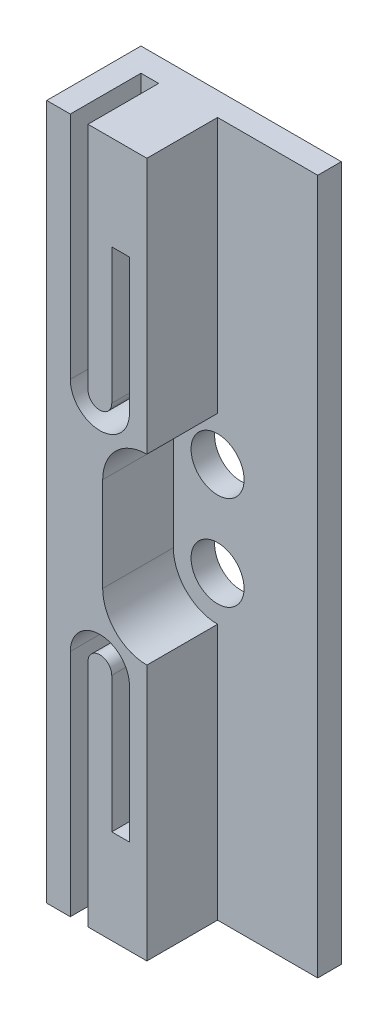
ISO-10303-21;
HEADER;
FILE_DESCRIPTION(('STEP AP214'),'2;1');
FILE_NAME('part.step','',(''),(''),'','','');
FILE_SCHEMA(('AUTOMOTIVE_DESIGN { 1 0 10303 214 1 1 1 1 }'));
ENDSEC;
DATA;
#1=APPLICATION_CONTEXT('core data for automotive mechanical design processes');
#2=APPLICATION_PROTOCOL_DEFINITION('international standard','automotive_design',2000,#1);
#3=PRODUCT_CONTEXT('',#1,'mechanical');
#4=PRODUCT('Part','Part','',(#3));
#5=PRODUCT_RELATED_PRODUCT_CATEGORY('part','',(#4));
#6=PRODUCT_DEFINITION_FORMATION('','',#4);
#7=PRODUCT_DEFINITION_CONTEXT('part definition',#1,'design');
#8=PRODUCT_DEFINITION('design','',#6,#7);
#9=PRODUCT_DEFINITION_SHAPE('','',#8);
#10=(LENGTH_UNIT() NAMED_UNIT(*) SI_UNIT(.MILLI.,.METRE.));
#11=(NAMED_UNIT(*) PLANE_ANGLE_UNIT() SI_UNIT($,.RADIAN.));
#12=(NAMED_UNIT(*) SI_UNIT($,.STERADIAN.) SOLID_ANGLE_UNIT());
#13=UNCERTAINTY_MEASURE_WITH_UNIT(LENGTH_MEASURE(1.E-05),#10,'distance_accuracy_value','');
#14=(GEOMETRIC_REPRESENTATION_CONTEXT(3) GLOBAL_UNCERTAINTY_ASSIGNED_CONTEXT((#13)) GLOBAL_UNIT_ASSIGNED_CONTEXT((#10,
#11,#12)) REPRESENTATION_CONTEXT('',''));
#15=CARTESIAN_POINT('',(0.,0.,0.));
#16=DIRECTION('',(0.,0.,1.));
#17=DIRECTION('',(1.,0.,0.));
#18=AXIS2_PLACEMENT_3D('',#15,#16,#17);
#19=CARTESIAN_POINT('',(8.5,-33.5,-6.));
#20=DIRECTION('',(0.,0.,1.));
#21=DIRECTION('',(1.,0.,0.));
#22=AXIS2_PLACEMENT_3D('',#19,#20,#21);
#23=CYLINDRICAL_SURFACE('',#22,2.25);
#24=CARTESIAN_POINT('',(8.5,-33.5,0.));
#25=DIRECTION('',(0.,0.,1.));
#26=DIRECTION('',(1.,0.,0.));
#27=AXIS2_PLACEMENT_3D('',#24,#25,#26);
#28=CIRCLE('',#27,2.25);
#29=CARTESIAN_POINT('',(10.75,-33.5,0.));
#30=VERTEX_POINT('',#29);
#31=EDGE_CURVE('E253',#30,#30,#28,.T.);
#32=ORIENTED_EDGE('',*,*,#31,.F.);
#33=EDGE_LOOP('',(#32));
#34=FACE_BOUND('',#33,.T.);
#35=CARTESIAN_POINT('',(8.5,-33.5,2.));
#36=DIRECTION('',(0.,0.,1.));
#37=DIRECTION('',(1.,0.,0.));
#38=AXIS2_PLACEMENT_3D('',#35,#36,#37);
#39=CIRCLE('',#38,2.25);
#40=CARTESIAN_POINT('',(10.75,-33.5,2.));
#41=VERTEX_POINT('',#40);
#42=EDGE_CURVE('E250',#41,#41,#39,.T.);
#43=ORIENTED_EDGE('',*,*,#42,.T.);
#44=EDGE_LOOP('',(#43));
#45=FACE_BOUND('',#44,.T.);
#46=ADVANCED_FACE('F33',(#34,#45),#23,.F.);
#47=CARTESIAN_POINT('',(8.5,-25.5,-6.));
#48=DIRECTION('',(0.,0.,1.));
#49=DIRECTION('',(1.,0.,0.));
#50=AXIS2_PLACEMENT_3D('',#47,#48,#49);
#51=CYLINDRICAL_SURFACE('',#50,2.25);
#52=CARTESIAN_POINT('',(8.5,-25.5,0.));
#53=DIRECTION('',(0.,0.,1.));
#54=DIRECTION('',(1.,0.,0.));
#55=AXIS2_PLACEMENT_3D('',#52,#53,#54);
#56=CIRCLE('',#55,2.25);
#57=CARTESIAN_POINT('',(10.75,-25.5,0.));
#58=VERTEX_POINT('',#57);
#59=EDGE_CURVE('E247',#58,#58,#56,.T.);
#60=ORIENTED_EDGE('',*,*,#59,.F.);
#61=EDGE_LOOP('',(#60));
#62=FACE_BOUND('',#61,.T.);
#63=CARTESIAN_POINT('',(8.5,-25.5,2.));
#64=DIRECTION('',(0.,0.,1.));
#65=DIRECTION('',(1.,0.,0.));
#66=AXIS2_PLACEMENT_3D('',#63,#64,#65);
#67=CIRCLE('',#66,2.25);
#68=CARTESIAN_POINT('',(10.75,-25.5,2.));
#69=VERTEX_POINT('',#68);
#70=EDGE_CURVE('E241',#69,#69,#67,.T.);
#71=ORIENTED_EDGE('',*,*,#70,.T.);
#72=EDGE_LOOP('',(#71));
#73=FACE_BOUND('',#72,.T.);
#74=ADVANCED_FACE('F463',(#62,#73),#51,.F.);
#75=CARTESIAN_POINT('',(8.50000000000001,0.,8.));
#76=DIRECTION('',(-1.,0.,0.));
#77=DIRECTION('',(0.,0.,1.));
#78=AXIS2_PLACEMENT_3D('',#75,#76,#77);
#79=PLANE('',#78);
#80=DIRECTION('',(0.,1.,0.));
#81=VECTOR('',#80,1.);
#82=CARTESIAN_POINT('',(8.50000000000001,0.,2.));
#83=LINE('',#82,#81);
#84=CARTESIAN_POINT('',(8.50000000000001,-59.,2.));
#85=VERTEX_POINT('',#84);
#86=CARTESIAN_POINT('',(8.50000000000001,-37.25,2.));
#87=VERTEX_POINT('',#86);
#88=EDGE_CURVE('E374',#85,#87,#83,.T.);
#89=ORIENTED_EDGE('',*,*,#88,.T.);
#90=DIRECTION('',(0.,0.,1.));
#91=VECTOR('',#90,1.);
#92=CARTESIAN_POINT('',(8.50000000000001,-37.25,2.));
#93=LINE('',#92,#91);
#94=CARTESIAN_POINT('',(8.50000000000001,-37.25,8.));
#95=VERTEX_POINT('',#94);
#96=EDGE_CURVE('E217',#87,#95,#93,.T.);
#97=ORIENTED_EDGE('',*,*,#96,.T.);
#98=DIRECTION('',(0.,1.,0.));
#99=VECTOR('',#98,1.);
#100=CARTESIAN_POINT('',(8.50000000000001,0.,8.));
#101=LINE('',#100,#99);
#102=CARTESIAN_POINT('',(8.50000000000001,-59.,8.));
#103=VERTEX_POINT('',#102);
#104=EDGE_CURVE('E379',#103,#95,#101,.T.);
#105=ORIENTED_EDGE('',*,*,#104,.F.);
#106=DIRECTION('',(0.,0.,-1.));
#107=VECTOR('',#106,1.);
#108=CARTESIAN_POINT('',(8.50000000000001,-59.,8.));
#109=LINE('',#108,#107);
#110=EDGE_CURVE('E390',#103,#85,#109,.T.);
#111=ORIENTED_EDGE('',*,*,#110,.T.);
#112=EDGE_LOOP('',(#89,#97,#105,#111));
#113=FACE_BOUND('',#112,.T.);
#114=ADVANCED_FACE('F468',(#113),#79,.F.);
#115=CARTESIAN_POINT('',(0.,0.,8.));
#116=DIRECTION('',(0.,0.,1.));
#117=DIRECTION('',(1.,0.,0.));
#118=AXIS2_PLACEMENT_3D('',#115,#116,#117);
#119=PLANE('',#118);
#120=CARTESIAN_POINT('',(8.5,-25.5,8.));
#121=DIRECTION('',(0.,0.,1.));
#122=DIRECTION('',(1.,0.,0.));
#123=AXIS2_PLACEMENT_3D('',#120,#121,#122);
#124=CIRCLE('',#123,3.75);
#125=CARTESIAN_POINT('',(8.50000000000001,-21.75,8.));
#126=VERTEX_POINT('',#125);
#127=CARTESIAN_POINT('',(4.75,-25.5,8.));
#128=VERTEX_POINT('',#127);
#129=EDGE_CURVE('E227',#126,#128,#124,.T.);
#130=ORIENTED_EDGE('',*,*,#129,.F.);
#131=CARTESIAN_POINT('',(8.50000000000001,0.,8.));
#132=VERTEX_POINT('',#131);
#133=EDGE_CURVE('E378',#126,#132,#101,.T.);
#134=ORIENTED_EDGE('',*,*,#133,.T.);
#135=DIRECTION('',(-1.,0.,0.));
#136=VECTOR('',#135,1.);
#137=CARTESIAN_POINT('',(0.,0.,8.));
#138=LINE('',#137,#136);
#139=CARTESIAN_POINT('',(3.50000000000001,0.,8.));
#140=VERTEX_POINT('',#139);
#141=EDGE_CURVE('E383',#132,#140,#138,.T.);
#142=ORIENTED_EDGE('',*,*,#141,.T.);
#143=DIRECTION('',(0.,1.,0.));
#144=VECTOR('',#143,1.);
#145=CARTESIAN_POINT('',(3.50000000000001,0.,8.));
#146=LINE('',#145,#144);
#147=CARTESIAN_POINT('',(3.50000000000001,-19.5,8.));
#148=VERTEX_POINT('',#147);
#149=EDGE_CURVE('E282',#148,#140,#146,.T.);
#150=ORIENTED_EDGE('',*,*,#149,.F.);
#151=CARTESIAN_POINT('',(4.5099627510071,-19.5,8.));
#152=DIRECTION('',(0.,0.,1.));
#153=DIRECTION('',(1.,0.,0.));
#154=AXIS2_PLACEMENT_3D('',#151,#152,#153);
#155=CIRCLE('',#154,1.00996275100709);
#156=CARTESIAN_POINT('',(5.51992550201419,-19.5,8.));
#157=VERTEX_POINT('',#156);
#158=EDGE_CURVE('E279',#148,#157,#155,.T.);
#159=ORIENTED_EDGE('',*,*,#158,.T.);
#160=DIRECTION('',(0.,1.,0.));
#161=VECTOR('',#160,1.);
#162=CARTESIAN_POINT('',(5.51992550201419,0.,8.));
#163=LINE('',#162,#161);
#164=CARTESIAN_POINT('',(5.51992550201419,-8.,8.));
#165=VERTEX_POINT('',#164);
#166=EDGE_CURVE('E256',#157,#165,#163,.T.);
#167=ORIENTED_EDGE('',*,*,#166,.T.);
#168=DIRECTION('',(1.,0.,0.));
#169=VECTOR('',#168,1.);
#170=CARTESIAN_POINT('',(0.,-8.,8.));
#171=LINE('',#170,#169);
#172=CARTESIAN_POINT('',(7.01992550201418,-8.,8.));
#173=VERTEX_POINT('',#172);
#174=EDGE_CURVE('E261',#165,#173,#171,.T.);
#175=ORIENTED_EDGE('',*,*,#174,.T.);
#176=DIRECTION('',(0.,1.,0.));
#177=VECTOR('',#176,1.);
#178=CARTESIAN_POINT('',(7.01992550201418,0.,8.));
#179=LINE('',#178,#177);
#180=CARTESIAN_POINT('',(7.01992550201418,-19.5,8.));
#181=VERTEX_POINT('',#180);
#182=EDGE_CURVE('E290',#181,#173,#179,.T.);
#183=ORIENTED_EDGE('',*,*,#182,.F.);
#184=CARTESIAN_POINT('',(4.50996275100709,-19.5,8.));
#185=DIRECTION('',(0.,0.,1.));
#186=DIRECTION('',(1.,0.,0.));
#187=AXIS2_PLACEMENT_3D('',#184,#185,#186);
#188=CIRCLE('',#187,2.50996275100708);
#189=CARTESIAN_POINT('',(2.00000000000001,-19.5,8.));
#190=VERTEX_POINT('',#189);
#191=EDGE_CURVE('E287',#190,#181,#188,.T.);
#192=ORIENTED_EDGE('',*,*,#191,.F.);
#193=DIRECTION('',(0.,1.,0.));
#194=VECTOR('',#193,1.);
#195=CARTESIAN_POINT('',(2.00000000000001,0.,8.));
#196=LINE('',#195,#194);
#197=CARTESIAN_POINT('',(2.00000000000001,0.,8.));
#198=VERTEX_POINT('',#197);
#199=EDGE_CURVE('E284',#190,#198,#196,.T.);
#200=ORIENTED_EDGE('',*,*,#199,.T.);
#201=CARTESIAN_POINT('',(0.,0.,8.));
#202=VERTEX_POINT('',#201);
#203=EDGE_CURVE('E382',#198,#202,#138,.T.);
#204=ORIENTED_EDGE('',*,*,#203,.T.);
#205=DIRECTION('',(0.,-1.,0.));
#206=VECTOR('',#205,1.);
#207=CARTESIAN_POINT('',(0.,0.,8.));
#208=LINE('',#207,#206);
#209=CARTESIAN_POINT('',(0.,-59.,8.));
#210=VERTEX_POINT('',#209);
#211=EDGE_CURVE('E370',#202,#210,#208,.T.);
#212=ORIENTED_EDGE('',*,*,#211,.T.);
#213=DIRECTION('',(1.,0.,0.));
#214=VECTOR('',#213,1.);
#215=CARTESIAN_POINT('',(0.,-59.,8.));
#216=LINE('',#215,#214);
#217=CARTESIAN_POINT('',(2.00000000000001,-59.,8.));
#218=VERTEX_POINT('',#217);
#219=EDGE_CURVE('E375',#210,#218,#216,.T.);
#220=ORIENTED_EDGE('',*,*,#219,.T.);
#221=DIRECTION('',(0.,1.,0.));
#222=VECTOR('',#221,1.);
#223=CARTESIAN_POINT('',(2.00000000000001,0.,8.));
#224=LINE('',#223,#222);
#225=CARTESIAN_POINT('',(2.00000000000001,-39.5,8.));
#226=VERTEX_POINT('',#225);
#227=EDGE_CURVE('E316',#218,#226,#224,.T.);
#228=ORIENTED_EDGE('',*,*,#227,.T.);
#229=CARTESIAN_POINT('',(4.50996275100709,-39.5,8.));
#230=DIRECTION('',(0.,0.,1.));
#231=DIRECTION('',(1.,0.,0.));
#232=AXIS2_PLACEMENT_3D('',#229,#230,#231);
#233=CIRCLE('',#232,2.50996275100709);
#234=CARTESIAN_POINT('',(7.01992550201419,-39.5,8.));
#235=VERTEX_POINT('',#234);
#236=EDGE_CURVE('E348',#226,#235,#233,.F.);
#237=ORIENTED_EDGE('',*,*,#236,.T.);
#238=DIRECTION('',(0.,1.,0.));
#239=VECTOR('',#238,1.);
#240=CARTESIAN_POINT('',(7.01992550201418,0.,8.));
#241=LINE('',#240,#239);
#242=CARTESIAN_POINT('',(7.01992550201419,-51.,8.));
#243=VERTEX_POINT('',#242);
#244=EDGE_CURVE('E345',#243,#235,#241,.T.);
#245=ORIENTED_EDGE('',*,*,#244,.F.);
#246=DIRECTION('',(1.,0.,0.));
#247=VECTOR('',#246,1.);
#248=CARTESIAN_POINT('',(0.,-51.,8.));
#249=LINE('',#248,#247);
#250=CARTESIAN_POINT('',(5.51992550201419,-51.,8.));
#251=VERTEX_POINT('',#250);
#252=EDGE_CURVE('E342',#251,#243,#249,.T.);
#253=ORIENTED_EDGE('',*,*,#252,.F.);
#254=DIRECTION('',(0.,1.,0.));
#255=VECTOR('',#254,1.);
#256=CARTESIAN_POINT('',(5.51992550201419,0.,8.));
#257=LINE('',#256,#255);
#258=CARTESIAN_POINT('',(5.51992550201419,-39.5,8.));
#259=VERTEX_POINT('',#258);
#260=EDGE_CURVE('E339',#251,#259,#257,.T.);
#261=ORIENTED_EDGE('',*,*,#260,.T.);
#262=CARTESIAN_POINT('',(4.5099627510071,-39.5,8.));
#263=DIRECTION('',(0.,0.,1.));
#264=DIRECTION('',(1.,0.,0.));
#265=AXIS2_PLACEMENT_3D('',#262,#263,#264);
#266=CIRCLE('',#265,1.00996275100709);
#267=CARTESIAN_POINT('',(3.50000000000001,-39.5,8.));
#268=VERTEX_POINT('',#267);
#269=EDGE_CURVE('E336',#268,#259,#266,.F.);
#270=ORIENTED_EDGE('',*,*,#269,.F.);
#271=DIRECTION('',(0.,1.,0.));
#272=VECTOR('',#271,1.);
#273=CARTESIAN_POINT('',(3.50000000000001,0.,8.));
#274=LINE('',#273,#272);
#275=CARTESIAN_POINT('',(3.50000000000001,-59.,8.));
#276=VERTEX_POINT('',#275);
#277=EDGE_CURVE('E56',#276,#268,#274,.T.);
#278=ORIENTED_EDGE('',*,*,#277,.F.);
#279=EDGE_CURVE('E373',#276,#103,#216,.T.);
#280=ORIENTED_EDGE('',*,*,#279,.T.);
#281=ORIENTED_EDGE('',*,*,#104,.T.);
#282=CARTESIAN_POINT('',(8.5,-33.5,8.));
#283=DIRECTION('',(0.,0.,1.));
#284=DIRECTION('',(1.,0.,0.));
#285=AXIS2_PLACEMENT_3D('',#282,#283,#284);
#286=CIRCLE('',#285,3.75);
#287=CARTESIAN_POINT('',(4.75,-33.5,8.));
#288=VERTEX_POINT('',#287);
#289=EDGE_CURVE('E235',#288,#95,#286,.T.);
#290=ORIENTED_EDGE('',*,*,#289,.F.);
#291=DIRECTION('',(0.,1.,0.));
#292=VECTOR('',#291,1.);
#293=CARTESIAN_POINT('',(4.75,0.,8.));
#294=LINE('',#293,#292);
#295=EDGE_CURVE('E213',#288,#128,#294,.T.);
#296=ORIENTED_EDGE('',*,*,#295,.T.);
#297=EDGE_LOOP('',(#130,#134,#142,#150,#159,#167,#175,#183,#192,#200,#204,#212,#220,#228,#237,
#245,#253,#261,#270,#278,#280,#281,#290,#296));
#298=FACE_BOUND('',#297,.T.);
#299=ADVANCED_FACE('F438',(#298),#119,.T.);
#300=CARTESIAN_POINT('',(0.,0.,2.));
#301=DIRECTION('',(0.,-1.,0.));
#302=DIRECTION('',(0.,0.,-1.));
#303=AXIS2_PLACEMENT_3D('',#300,#301,#302);
#304=PLANE('',#303);
#305=DIRECTION('',(0.,0.,1.));
#306=VECTOR('',#305,1.);
#307=CARTESIAN_POINT('',(2.00000000000001,0.,2.));
#308=LINE('',#307,#306);
#309=CARTESIAN_POINT('',(2.00000000000001,0.,2.));
#310=VERTEX_POINT('',#309);
#311=EDGE_CURVE('E304',#310,#198,#308,.T.);
#312=ORIENTED_EDGE('',*,*,#311,.F.);
#313=DIRECTION('',(-1.,0.,0.));
#314=VECTOR('',#313,1.);
#315=CARTESIAN_POINT('',(0.,0.,2.));
#316=LINE('',#315,#314);
#317=CARTESIAN_POINT('',(3.50000000000001,0.,2.));
#318=VERTEX_POINT('',#317);
#319=EDGE_CURVE('E264',#318,#310,#316,.T.);
#320=ORIENTED_EDGE('',*,*,#319,.F.);
#321=DIRECTION('',(0.,0.,1.));
#322=VECTOR('',#321,1.);
#323=CARTESIAN_POINT('',(3.50000000000001,0.,2.));
#324=LINE('',#323,#322);
#325=EDGE_CURVE('E306',#318,#140,#324,.T.);
#326=ORIENTED_EDGE('',*,*,#325,.T.);
#327=ORIENTED_EDGE('',*,*,#141,.F.);
#328=DIRECTION('',(0.,0.,-1.));
#329=VECTOR('',#328,1.);
#330=CARTESIAN_POINT('',(8.50000000000001,0.,8.));
#331=LINE('',#330,#329);
#332=CARTESIAN_POINT('',(8.50000000000001,0.,2.));
#333=VERTEX_POINT('',#332);
#334=EDGE_CURVE('E386',#132,#333,#331,.T.);
#335=ORIENTED_EDGE('',*,*,#334,.T.);
#336=DIRECTION('',(-1.,0.,0.));
#337=VECTOR('',#336,1.);
#338=CARTESIAN_POINT('',(0.,0.,2.));
#339=LINE('',#338,#337);
#340=CARTESIAN_POINT('',(17.,0.,2.));
#341=VERTEX_POINT('',#340);
#342=EDGE_CURVE('E399',#341,#333,#339,.T.);
#343=ORIENTED_EDGE('',*,*,#342,.F.);
#344=DIRECTION('',(0.,0.,-1.));
#345=VECTOR('',#344,1.);
#346=CARTESIAN_POINT('',(17.,0.,2.));
#347=LINE('',#346,#345);
#348=CARTESIAN_POINT('',(17.,0.,0.));
#349=VERTEX_POINT('',#348);
#350=EDGE_CURVE('E412',#341,#349,#347,.T.);
#351=ORIENTED_EDGE('',*,*,#350,.T.);
#352=DIRECTION('',(-1.,0.,0.));
#353=VECTOR('',#352,1.);
#354=CARTESIAN_POINT('',(0.,0.,0.));
#355=LINE('',#354,#353);
#356=CARTESIAN_POINT('',(0.,0.,0.));
#357=VERTEX_POINT('',#356);
#358=EDGE_CURVE('E397',#349,#357,#355,.T.);
#359=ORIENTED_EDGE('',*,*,#358,.T.);
#360=DIRECTION('',(0.,0.,-1.));
#361=VECTOR('',#360,1.);
#362=CARTESIAN_POINT('',(0.,0.,2.));
#363=LINE('',#362,#361);
#364=EDGE_CURVE('E402',#202,#357,#363,.T.);
#365=ORIENTED_EDGE('',*,*,#364,.F.);
#366=ORIENTED_EDGE('',*,*,#203,.F.);
#367=EDGE_LOOP('',(#312,#320,#326,#327,#335,#343,#351,#359,#365,#366));
#368=FACE_BOUND('',#367,.T.);
#369=ADVANCED_FACE('F430',(#368),#304,.F.);
#370=CARTESIAN_POINT('',(0.,0.,2.));
#371=DIRECTION('',(1.,0.,0.));
#372=DIRECTION('',(0.,1.,0.));
#373=AXIS2_PLACEMENT_3D('',#370,#371,#372);
#374=PLANE('',#373);
#375=DIRECTION('',(0.,-1.,0.));
#376=VECTOR('',#375,1.);
#377=CARTESIAN_POINT('',(0.,0.,0.));
#378=LINE('',#377,#376);
#379=CARTESIAN_POINT('',(0.,-59.,0.));
#380=VERTEX_POINT('',#379);
#381=EDGE_CURVE('E393',#357,#380,#378,.T.);
#382=ORIENTED_EDGE('',*,*,#381,.T.);
#383=DIRECTION('',(0.,0.,-1.));
#384=VECTOR('',#383,1.);
#385=CARTESIAN_POINT('',(0.,-59.,2.));
#386=LINE('',#385,#384);
#387=EDGE_CURVE('E11',#210,#380,#386,.T.);
#388=ORIENTED_EDGE('',*,*,#387,.F.);
#389=ORIENTED_EDGE('',*,*,#211,.F.);
#390=ORIENTED_EDGE('',*,*,#364,.T.);
#391=EDGE_LOOP('',(#382,#388,#389,#390));
#392=FACE_BOUND('',#391,.T.);
#393=ADVANCED_FACE('F35',(#392),#374,.F.);
#394=CARTESIAN_POINT('',(0.,-59.,2.));
#395=DIRECTION('',(0.,1.,0.));
#396=DIRECTION('',(0.,0.,1.));
#397=AXIS2_PLACEMENT_3D('',#394,#395,#396);
#398=PLANE('',#397);
#399=ORIENTED_EDGE('',*,*,#279,.F.);
#400=DIRECTION('',(0.,0.,1.));
#401=VECTOR('',#400,1.);
#402=CARTESIAN_POINT('',(3.50000000000001,-59.,2.));
#403=LINE('',#402,#401);
#404=CARTESIAN_POINT('',(3.50000000000001,-59.,2.));
#405=VERTEX_POINT('',#404);
#406=EDGE_CURVE('E353',#405,#276,#403,.T.);
#407=ORIENTED_EDGE('',*,*,#406,.F.);
#408=DIRECTION('',(1.,0.,0.));
#409=VECTOR('',#408,1.);
#410=CARTESIAN_POINT('',(0.,-59.,2.));
#411=LINE('',#410,#409);
#412=CARTESIAN_POINT('',(2.00000000000001,-59.,2.));
#413=VERTEX_POINT('',#412);
#414=EDGE_CURVE('E331',#413,#405,#411,.T.);
#415=ORIENTED_EDGE('',*,*,#414,.F.);
#416=DIRECTION('',(0.,0.,1.));
#417=VECTOR('',#416,1.);
#418=CARTESIAN_POINT('',(2.00000000000001,-59.,2.));
#419=LINE('',#418,#417);
#420=EDGE_CURVE('E356',#413,#218,#419,.T.);
#421=ORIENTED_EDGE('',*,*,#420,.T.);
#422=ORIENTED_EDGE('',*,*,#219,.F.);
#423=ORIENTED_EDGE('',*,*,#387,.T.);
#424=DIRECTION('',(1.,0.,0.));
#425=VECTOR('',#424,1.);
#426=CARTESIAN_POINT('',(0.,-59.,0.));
#427=LINE('',#426,#425);
#428=CARTESIAN_POINT('',(17.,-59.,0.));
#429=VERTEX_POINT('',#428);
#430=EDGE_CURVE('E405',#380,#429,#427,.T.);
#431=ORIENTED_EDGE('',*,*,#430,.T.);
#432=DIRECTION('',(0.,0.,-1.));
#433=VECTOR('',#432,1.);
#434=CARTESIAN_POINT('',(17.,-59.,2.));
#435=LINE('',#434,#433);
#436=CARTESIAN_POINT('',(17.,-59.,2.));
#437=VERTEX_POINT('',#436);
#438=EDGE_CURVE('E41',#437,#429,#435,.T.);
#439=ORIENTED_EDGE('',*,*,#438,.F.);
#440=DIRECTION('',(1.,0.,0.));
#441=VECTOR('',#440,1.);
#442=CARTESIAN_POINT('',(0.,-59.,2.));
#443=LINE('',#442,#441);
#444=EDGE_CURVE('E394',#85,#437,#443,.T.);
#445=ORIENTED_EDGE('',*,*,#444,.F.);
#446=ORIENTED_EDGE('',*,*,#110,.F.);
#447=EDGE_LOOP('',(#399,#407,#415,#421,#422,#423,#431,#439,#445,#446));
#448=FACE_BOUND('',#447,.T.);
#449=ADVANCED_FACE('F486',(#448),#398,.F.);
#450=CARTESIAN_POINT('',(17.,0.,2.));
#451=DIRECTION('',(-1.,0.,0.));
#452=DIRECTION('',(0.,-1.,0.));
#453=AXIS2_PLACEMENT_3D('',#450,#451,#452);
#454=PLANE('',#453);
#455=DIRECTION('',(0.,1.,0.));
#456=VECTOR('',#455,1.);
#457=CARTESIAN_POINT('',(17.,0.,0.));
#458=LINE('',#457,#456);
#459=EDGE_CURVE('E407',#429,#349,#458,.T.);
#460=ORIENTED_EDGE('',*,*,#459,.T.);
#461=ORIENTED_EDGE('',*,*,#350,.F.);
#462=DIRECTION('',(0.,1.,0.));
#463=VECTOR('',#462,1.);
#464=CARTESIAN_POINT('',(17.,0.,2.));
#465=LINE('',#464,#463);
#466=EDGE_CURVE('E396',#437,#341,#465,.T.);
#467=ORIENTED_EDGE('',*,*,#466,.F.);
#468=ORIENTED_EDGE('',*,*,#438,.T.);
#469=EDGE_LOOP('',(#460,#461,#467,#468));
#470=FACE_BOUND('',#469,.T.);
#471=ADVANCED_FACE('F419',(#470),#454,.F.);
#472=CARTESIAN_POINT('',(0.,0.,2.));
#473=DIRECTION('',(0.,0.,1.));
#474=DIRECTION('',(1.,0.,0.));
#475=AXIS2_PLACEMENT_3D('',#472,#473,#474);
#476=PLANE('',#475);
#477=ORIENTED_EDGE('',*,*,#70,.F.);
#478=EDGE_LOOP('',(#477));
#479=FACE_BOUND('',#478,.T.);
#480=ORIENTED_EDGE('',*,*,#42,.F.);
#481=EDGE_LOOP('',(#480));
#482=FACE_BOUND('',#481,.T.);
#483=CARTESIAN_POINT('',(8.5,-33.5,2.));
#484=DIRECTION('',(0.,0.,1.));
#485=DIRECTION('',(1.,0.,0.));
#486=AXIS2_PLACEMENT_3D('',#483,#484,#485);
#487=CIRCLE('',#486,3.75);
#488=CARTESIAN_POINT('',(4.75,-33.5,2.));
#489=VERTEX_POINT('',#488);
#490=EDGE_CURVE('E224',#489,#87,#487,.T.);
#491=ORIENTED_EDGE('',*,*,#490,.T.);
#492=ORIENTED_EDGE('',*,*,#88,.F.);
#493=ORIENTED_EDGE('',*,*,#444,.T.);
#494=ORIENTED_EDGE('',*,*,#466,.T.);
#495=ORIENTED_EDGE('',*,*,#342,.T.);
#496=CARTESIAN_POINT('',(8.50000000000001,-21.75,2.));
#497=VERTEX_POINT('',#496);
#498=EDGE_CURVE('E355',#497,#333,#83,.T.);
#499=ORIENTED_EDGE('',*,*,#498,.F.);
#500=CARTESIAN_POINT('',(8.5,-25.5,2.));
#501=DIRECTION('',(0.,0.,1.));
#502=DIRECTION('',(1.,0.,0.));
#503=AXIS2_PLACEMENT_3D('',#500,#501,#502);
#504=CIRCLE('',#503,3.75);
#505=CARTESIAN_POINT('',(4.75,-25.5,2.));
#506=VERTEX_POINT('',#505);
#507=EDGE_CURVE('E218',#497,#506,#504,.T.);
#508=ORIENTED_EDGE('',*,*,#507,.T.);
#509=DIRECTION('',(0.,1.,0.));
#510=VECTOR('',#509,1.);
#511=CARTESIAN_POINT('',(4.75,0.,2.));
#512=LINE('',#511,#510);
#513=EDGE_CURVE('E210',#489,#506,#512,.T.);
#514=ORIENTED_EDGE('',*,*,#513,.F.);
#515=EDGE_LOOP('',(#491,#492,#493,#494,#495,#499,#508,#514));
#516=FACE_BOUND('',#515,.T.);
#517=ADVANCED_FACE('F223',(#479,#482,#516),#476,.T.);
#518=CARTESIAN_POINT('',(0.,0.,0.));
#519=DIRECTION('',(0.,0.,1.));
#520=DIRECTION('',(1.,0.,0.));
#521=AXIS2_PLACEMENT_3D('',#518,#519,#520);
#522=PLANE('',#521);
#523=ORIENTED_EDGE('',*,*,#59,.T.);
#524=EDGE_LOOP('',(#523));
#525=FACE_BOUND('',#524,.T.);
#526=ORIENTED_EDGE('',*,*,#31,.T.);
#527=EDGE_LOOP('',(#526));
#528=FACE_BOUND('',#527,.T.);
#529=ORIENTED_EDGE('',*,*,#381,.F.);
#530=ORIENTED_EDGE('',*,*,#358,.F.);
#531=ORIENTED_EDGE('',*,*,#459,.F.);
#532=ORIENTED_EDGE('',*,*,#430,.F.);
#533=EDGE_LOOP('',(#529,#530,#531,#532));
#534=FACE_BOUND('',#533,.T.);
#535=ADVANCED_FACE('F426',(#525,#528,#534),#522,.F.);
#536=ORIENTED_EDGE('',*,*,#133,.F.);
#537=DIRECTION('',(0.,0.,1.));
#538=VECTOR('',#537,1.);
#539=CARTESIAN_POINT('',(8.50000000000001,-21.75,2.));
#540=LINE('',#539,#538);
#541=EDGE_CURVE('E242',#497,#126,#540,.T.);
#542=ORIENTED_EDGE('',*,*,#541,.F.);
#543=ORIENTED_EDGE('',*,*,#498,.T.);
#544=ORIENTED_EDGE('',*,*,#334,.F.);
#545=EDGE_LOOP('',(#536,#542,#543,#544));
#546=FACE_BOUND('',#545,.T.);
#547=ADVANCED_FACE('F530',(#546),#79,.F.);
#548=CARTESIAN_POINT('',(3.50000000000001,0.,2.));
#549=DIRECTION('',(1.,0.,0.));
#550=DIRECTION('',(0.,0.,-1.));
#551=AXIS2_PLACEMENT_3D('',#548,#549,#550);
#552=PLANE('',#551);
#553=ORIENTED_EDGE('',*,*,#277,.T.);
#554=DIRECTION('',(0.,0.,1.));
#555=VECTOR('',#554,1.);
#556=CARTESIAN_POINT('',(3.50000000000001,-39.5,2.));
#557=LINE('',#556,#555);
#558=CARTESIAN_POINT('',(3.50000000000001,-39.5,2.));
#559=VERTEX_POINT('',#558);
#560=EDGE_CURVE('E334',#559,#268,#557,.T.);
#561=ORIENTED_EDGE('',*,*,#560,.F.);
#562=DIRECTION('',(0.,1.,0.));
#563=VECTOR('',#562,1.);
#564=CARTESIAN_POINT('',(3.50000000000001,0.,2.));
#565=LINE('',#564,#563);
#566=EDGE_CURVE('E312',#405,#559,#565,.T.);
#567=ORIENTED_EDGE('',*,*,#566,.F.);
#568=ORIENTED_EDGE('',*,*,#406,.T.);
#569=EDGE_LOOP('',(#553,#561,#567,#568));
#570=FACE_BOUND('',#569,.T.);
#571=ADVANCED_FACE('F496',(#570),#552,.F.);
#572=CARTESIAN_POINT('',(2.00000000000001,0.,2.));
#573=DIRECTION('',(1.,0.,0.));
#574=DIRECTION('',(0.,0.,-1.));
#575=AXIS2_PLACEMENT_3D('',#572,#573,#574);
#576=PLANE('',#575);
#577=ORIENTED_EDGE('',*,*,#227,.F.);
#578=ORIENTED_EDGE('',*,*,#420,.F.);
#579=DIRECTION('',(0.,1.,0.));
#580=VECTOR('',#579,1.);
#581=CARTESIAN_POINT('',(2.00000000000001,0.,2.));
#582=LINE('',#581,#580);
#583=CARTESIAN_POINT('',(2.00000000000001,-39.5,2.));
#584=VERTEX_POINT('',#583);
#585=EDGE_CURVE('E329',#413,#584,#582,.T.);
#586=ORIENTED_EDGE('',*,*,#585,.T.);
#587=DIRECTION('',(0.,0.,1.));
#588=VECTOR('',#587,1.);
#589=CARTESIAN_POINT('',(2.00000000000001,-39.5,2.));
#590=LINE('',#589,#588);
#591=EDGE_CURVE('E359',#584,#226,#590,.T.);
#592=ORIENTED_EDGE('',*,*,#591,.T.);
#593=EDGE_LOOP('',(#577,#578,#586,#592));
#594=FACE_BOUND('',#593,.T.);
#595=ADVANCED_FACE('F502',(#594),#576,.T.);
#596=CARTESIAN_POINT('',(4.50996275100709,-39.5,2.));
#597=DIRECTION('',(0.,0.,1.));
#598=DIRECTION('',(1.,0.,0.));
#599=AXIS2_PLACEMENT_3D('',#596,#597,#598);
#600=CYLINDRICAL_SURFACE('',#599,2.50996275100709);
#601=ORIENTED_EDGE('',*,*,#236,.F.);
#602=ORIENTED_EDGE('',*,*,#591,.F.);
#603=CARTESIAN_POINT('',(4.50996275100709,-39.5,2.));
#604=DIRECTION('',(0.,0.,1.));
#605=DIRECTION('',(1.,0.,0.));
#606=AXIS2_PLACEMENT_3D('',#603,#604,#605);
#607=CIRCLE('',#606,2.50996275100709);
#608=CARTESIAN_POINT('',(7.01992550201419,-39.5,2.));
#609=VERTEX_POINT('',#608);
#610=EDGE_CURVE('E327',#584,#609,#607,.F.);
#611=ORIENTED_EDGE('',*,*,#610,.T.);
#612=DIRECTION('',(0.,0.,1.));
#613=VECTOR('',#612,1.);
#614=CARTESIAN_POINT('',(7.01992550201419,-39.5,2.));
#615=LINE('',#614,#613);
#616=EDGE_CURVE('E361',#609,#235,#615,.T.);
#617=ORIENTED_EDGE('',*,*,#616,.T.);
#618=EDGE_LOOP('',(#601,#602,#611,#617));
#619=FACE_BOUND('',#618,.T.);
#620=ADVANCED_FACE('F507',(#619),#600,.F.);
#621=CARTESIAN_POINT('',(7.01992550201418,0.,2.));
#622=DIRECTION('',(1.,0.,0.));
#623=DIRECTION('',(0.,1.,0.));
#624=AXIS2_PLACEMENT_3D('',#621,#622,#623);
#625=PLANE('',#624);
#626=ORIENTED_EDGE('',*,*,#244,.T.);
#627=ORIENTED_EDGE('',*,*,#616,.F.);
#628=DIRECTION('',(0.,1.,0.));
#629=VECTOR('',#628,1.);
#630=CARTESIAN_POINT('',(7.01992550201418,0.,2.));
#631=LINE('',#630,#629);
#632=CARTESIAN_POINT('',(7.01992550201419,-51.,2.));
#633=VERTEX_POINT('',#632);
#634=EDGE_CURVE('E324',#633,#609,#631,.T.);
#635=ORIENTED_EDGE('',*,*,#634,.F.);
#636=DIRECTION('',(0.,0.,1.));
#637=VECTOR('',#636,1.);
#638=CARTESIAN_POINT('',(7.01992550201419,-51.,2.));
#639=LINE('',#638,#637);
#640=EDGE_CURVE('E363',#633,#243,#639,.T.);
#641=ORIENTED_EDGE('',*,*,#640,.T.);
#642=EDGE_LOOP('',(#626,#627,#635,#641));
#643=FACE_BOUND('',#642,.T.);
#644=ADVANCED_FACE('F511',(#643),#625,.F.);
#645=CARTESIAN_POINT('',(0.,-51.,2.));
#646=DIRECTION('',(0.,-1.,0.));
#647=DIRECTION('',(0.,0.,-1.));
#648=AXIS2_PLACEMENT_3D('',#645,#646,#647);
#649=PLANE('',#648);
#650=ORIENTED_EDGE('',*,*,#252,.T.);
#651=ORIENTED_EDGE('',*,*,#640,.F.);
#652=DIRECTION('',(1.,0.,0.));
#653=VECTOR('',#652,1.);
#654=CARTESIAN_POINT('',(0.,-51.,2.));
#655=LINE('',#654,#653);
#656=CARTESIAN_POINT('',(5.51992550201419,-51.,2.));
#657=VERTEX_POINT('',#656);
#658=EDGE_CURVE('E321',#657,#633,#655,.T.);
#659=ORIENTED_EDGE('',*,*,#658,.F.);
#660=DIRECTION('',(0.,0.,1.));
#661=VECTOR('',#660,1.);
#662=CARTESIAN_POINT('',(5.51992550201419,-51.,2.));
#663=LINE('',#662,#661);
#664=EDGE_CURVE('E365',#657,#251,#663,.T.);
#665=ORIENTED_EDGE('',*,*,#664,.T.);
#666=EDGE_LOOP('',(#650,#651,#659,#665));
#667=FACE_BOUND('',#666,.T.);
#668=ADVANCED_FACE('F514',(#667),#649,.F.);
#669=CARTESIAN_POINT('',(5.51992550201419,0.,2.));
#670=DIRECTION('',(1.,0.,0.));
#671=DIRECTION('',(0.,0.,-1.));
#672=AXIS2_PLACEMENT_3D('',#669,#670,#671);
#673=PLANE('',#672);
#674=ORIENTED_EDGE('',*,*,#260,.F.);
#675=ORIENTED_EDGE('',*,*,#664,.F.);
#676=DIRECTION('',(0.,1.,0.));
#677=VECTOR('',#676,1.);
#678=CARTESIAN_POINT('',(5.51992550201419,0.,2.));
#679=LINE('',#678,#677);
#680=CARTESIAN_POINT('',(5.51992550201419,-39.5,2.));
#681=VERTEX_POINT('',#680);
#682=EDGE_CURVE('E319',#657,#681,#679,.T.);
#683=ORIENTED_EDGE('',*,*,#682,.T.);
#684=DIRECTION('',(0.,0.,1.));
#685=VECTOR('',#684,1.);
#686=CARTESIAN_POINT('',(5.51992550201419,-39.5,2.));
#687=LINE('',#686,#685);
#688=EDGE_CURVE('E367',#681,#259,#687,.T.);
#689=ORIENTED_EDGE('',*,*,#688,.T.);
#690=EDGE_LOOP('',(#674,#675,#683,#689));
#691=FACE_BOUND('',#690,.T.);
#692=ADVANCED_FACE('F517',(#691),#673,.T.);
#693=CARTESIAN_POINT('',(4.5099627510071,-39.5,2.));
#694=DIRECTION('',(0.,0.,1.));
#695=DIRECTION('',(1.,0.,0.));
#696=AXIS2_PLACEMENT_3D('',#693,#694,#695);
#697=CYLINDRICAL_SURFACE('',#696,1.00996275100709);
#698=ORIENTED_EDGE('',*,*,#269,.T.);
#699=ORIENTED_EDGE('',*,*,#688,.F.);
#700=CARTESIAN_POINT('',(4.5099627510071,-39.5,2.));
#701=DIRECTION('',(0.,0.,1.));
#702=DIRECTION('',(1.,0.,0.));
#703=AXIS2_PLACEMENT_3D('',#700,#701,#702);
#704=CIRCLE('',#703,1.00996275100709);
#705=EDGE_CURVE('E315',#559,#681,#704,.F.);
#706=ORIENTED_EDGE('',*,*,#705,.F.);
#707=ORIENTED_EDGE('',*,*,#560,.T.);
#708=EDGE_LOOP('',(#698,#699,#706,#707));
#709=FACE_BOUND('',#708,.T.);
#710=ADVANCED_FACE('F494',(#709),#697,.T.);
#711=CARTESIAN_POINT('',(0.,0.,2.));
#712=DIRECTION('',(0.,0.,1.));
#713=DIRECTION('',(1.,0.,0.));
#714=AXIS2_PLACEMENT_3D('',#711,#712,#713);
#715=PLANE('',#714);
#716=ORIENTED_EDGE('',*,*,#566,.T.);
#717=ORIENTED_EDGE('',*,*,#705,.T.);
#718=ORIENTED_EDGE('',*,*,#682,.F.);
#719=ORIENTED_EDGE('',*,*,#658,.T.);
#720=ORIENTED_EDGE('',*,*,#634,.T.);
#721=ORIENTED_EDGE('',*,*,#610,.F.);
#722=ORIENTED_EDGE('',*,*,#585,.F.);
#723=ORIENTED_EDGE('',*,*,#414,.T.);
#724=EDGE_LOOP('',(#716,#717,#718,#719,#720,#721,#722,#723));
#725=FACE_BOUND('',#724,.T.);
#726=ADVANCED_FACE('F499',(#725),#715,.T.);
#727=CARTESIAN_POINT('',(5.51992550201419,0.,2.));
#728=DIRECTION('',(1.,0.,0.));
#729=DIRECTION('',(0.,0.,-1.));
#730=AXIS2_PLACEMENT_3D('',#727,#728,#729);
#731=PLANE('',#730);
#732=ORIENTED_EDGE('',*,*,#166,.F.);
#733=DIRECTION('',(0.,0.,1.));
#734=VECTOR('',#733,1.);
#735=CARTESIAN_POINT('',(5.51992550201419,-19.5,2.));
#736=LINE('',#735,#734);
#737=CARTESIAN_POINT('',(5.51992550201419,-19.5,2.));
#738=VERTEX_POINT('',#737);
#739=EDGE_CURVE('E276',#738,#157,#736,.T.);
#740=ORIENTED_EDGE('',*,*,#739,.F.);
#741=DIRECTION('',(0.,1.,0.));
#742=VECTOR('',#741,1.);
#743=CARTESIAN_POINT('',(5.51992550201419,0.,2.));
#744=LINE('',#743,#742);
#745=CARTESIAN_POINT('',(5.51992550201419,-8.,2.));
#746=VERTEX_POINT('',#745);
#747=EDGE_CURVE('E257',#738,#746,#744,.T.);
#748=ORIENTED_EDGE('',*,*,#747,.T.);
#749=DIRECTION('',(0.,0.,1.));
#750=VECTOR('',#749,1.);
#751=CARTESIAN_POINT('',(5.51992550201419,-8.,2.));
#752=LINE('',#751,#750);
#753=EDGE_CURVE('E295',#746,#165,#752,.T.);
#754=ORIENTED_EDGE('',*,*,#753,.T.);
#755=EDGE_LOOP('',(#732,#740,#748,#754));
#756=FACE_BOUND('',#755,.T.);
#757=ADVANCED_FACE('F641',(#756),#731,.T.);
#758=CARTESIAN_POINT('',(0.,-8.,2.));
#759=DIRECTION('',(0.,-1.,0.));
#760=DIRECTION('',(0.,0.,-1.));
#761=AXIS2_PLACEMENT_3D('',#758,#759,#760);
#762=PLANE('',#761);
#763=ORIENTED_EDGE('',*,*,#174,.F.);
#764=ORIENTED_EDGE('',*,*,#753,.F.);
#765=DIRECTION('',(1.,0.,0.));
#766=VECTOR('',#765,1.);
#767=CARTESIAN_POINT('',(0.,-8.,2.));
#768=LINE('',#767,#766);
#769=CARTESIAN_POINT('',(7.01992550201418,-8.,2.));
#770=VERTEX_POINT('',#769);
#771=EDGE_CURVE('E274',#746,#770,#768,.T.);
#772=ORIENTED_EDGE('',*,*,#771,.T.);
#773=DIRECTION('',(0.,0.,1.));
#774=VECTOR('',#773,1.);
#775=CARTESIAN_POINT('',(7.01992550201418,-8.,2.));
#776=LINE('',#775,#774);
#777=EDGE_CURVE('E298',#770,#173,#776,.T.);
#778=ORIENTED_EDGE('',*,*,#777,.T.);
#779=EDGE_LOOP('',(#763,#764,#772,#778));
#780=FACE_BOUND('',#779,.T.);
#781=ADVANCED_FACE('F631',(#780),#762,.T.);
#782=CARTESIAN_POINT('',(7.01992550201418,0.,2.));
#783=DIRECTION('',(1.,0.,0.));
#784=DIRECTION('',(0.,1.,0.));
#785=AXIS2_PLACEMENT_3D('',#782,#783,#784);
#786=PLANE('',#785);
#787=ORIENTED_EDGE('',*,*,#182,.T.);
#788=ORIENTED_EDGE('',*,*,#777,.F.);
#789=DIRECTION('',(0.,1.,0.));
#790=VECTOR('',#789,1.);
#791=CARTESIAN_POINT('',(7.01992550201418,0.,2.));
#792=LINE('',#791,#790);
#793=CARTESIAN_POINT('',(7.01992550201418,-19.5,2.));
#794=VERTEX_POINT('',#793);
#795=EDGE_CURVE('E271',#794,#770,#792,.T.);
#796=ORIENTED_EDGE('',*,*,#795,.F.);
#797=DIRECTION('',(0.,0.,1.));
#798=VECTOR('',#797,1.);
#799=CARTESIAN_POINT('',(7.01992550201418,-19.5,2.));
#800=LINE('',#799,#798);
#801=EDGE_CURVE('E300',#794,#181,#800,.T.);
#802=ORIENTED_EDGE('',*,*,#801,.T.);
#803=EDGE_LOOP('',(#787,#788,#796,#802));
#804=FACE_BOUND('',#803,.T.);
#805=ADVANCED_FACE('F621',(#804),#786,.F.);
#806=CARTESIAN_POINT('',(4.50996275100709,-19.5,2.));
#807=DIRECTION('',(0.,0.,1.));
#808=DIRECTION('',(1.,0.,0.));
#809=AXIS2_PLACEMENT_3D('',#806,#807,#808);
#810=CYLINDRICAL_SURFACE('',#809,2.50996275100708);
#811=ORIENTED_EDGE('',*,*,#191,.T.);
#812=ORIENTED_EDGE('',*,*,#801,.F.);
#813=CARTESIAN_POINT('',(4.50996275100709,-19.5,2.));
#814=DIRECTION('',(0.,0.,1.));
#815=DIRECTION('',(1.,0.,0.));
#816=AXIS2_PLACEMENT_3D('',#813,#814,#815);
#817=CIRCLE('',#816,2.50996275100708);
#818=CARTESIAN_POINT('',(2.00000000000001,-19.5,2.));
#819=VERTEX_POINT('',#818);
#820=EDGE_CURVE('E268',#819,#794,#817,.T.);
#821=ORIENTED_EDGE('',*,*,#820,.F.);
#822=DIRECTION('',(0.,0.,1.));
#823=VECTOR('',#822,1.);
#824=CARTESIAN_POINT('',(2.00000000000001,-19.5,2.));
#825=LINE('',#824,#823);
#826=EDGE_CURVE('E302',#819,#190,#825,.T.);
#827=ORIENTED_EDGE('',*,*,#826,.T.);
#828=EDGE_LOOP('',(#811,#812,#821,#827));
#829=FACE_BOUND('',#828,.T.);
#830=ADVANCED_FACE('F612',(#829),#810,.F.);
#831=CARTESIAN_POINT('',(2.00000000000001,0.,2.));
#832=DIRECTION('',(1.,0.,0.));
#833=DIRECTION('',(0.,0.,-1.));
#834=AXIS2_PLACEMENT_3D('',#831,#832,#833);
#835=PLANE('',#834);
#836=ORIENTED_EDGE('',*,*,#199,.F.);
#837=ORIENTED_EDGE('',*,*,#826,.F.);
#838=DIRECTION('',(0.,1.,0.));
#839=VECTOR('',#838,1.);
#840=CARTESIAN_POINT('',(2.00000000000001,0.,2.));
#841=LINE('',#840,#839);
#842=EDGE_CURVE('E266',#819,#310,#841,.T.);
#843=ORIENTED_EDGE('',*,*,#842,.T.);
#844=ORIENTED_EDGE('',*,*,#311,.T.);
#845=EDGE_LOOP('',(#836,#837,#843,#844));
#846=FACE_BOUND('',#845,.T.);
#847=ADVANCED_FACE('F443',(#846),#835,.T.);
#848=CARTESIAN_POINT('',(3.50000000000001,0.,2.));
#849=DIRECTION('',(1.,0.,0.));
#850=DIRECTION('',(0.,0.,-1.));
#851=AXIS2_PLACEMENT_3D('',#848,#849,#850);
#852=PLANE('',#851);
#853=ORIENTED_EDGE('',*,*,#149,.T.);
#854=ORIENTED_EDGE('',*,*,#325,.F.);
#855=DIRECTION('',(0.,1.,0.));
#856=VECTOR('',#855,1.);
#857=CARTESIAN_POINT('',(3.50000000000001,0.,2.));
#858=LINE('',#857,#856);
#859=CARTESIAN_POINT('',(3.50000000000001,-19.5,2.));
#860=VERTEX_POINT('',#859);
#861=EDGE_CURVE('E48',#860,#318,#858,.T.);
#862=ORIENTED_EDGE('',*,*,#861,.F.);
#863=DIRECTION('',(0.,0.,1.));
#864=VECTOR('',#863,1.);
#865=CARTESIAN_POINT('',(3.50000000000001,-19.5,2.));
#866=LINE('',#865,#864);
#867=EDGE_CURVE('E309',#860,#148,#866,.T.);
#868=ORIENTED_EDGE('',*,*,#867,.T.);
#869=EDGE_LOOP('',(#853,#854,#862,#868));
#870=FACE_BOUND('',#869,.T.);
#871=ADVANCED_FACE('F457',(#870),#852,.F.);
#872=CARTESIAN_POINT('',(4.5099627510071,-19.5,2.));
#873=DIRECTION('',(0.,0.,1.));
#874=DIRECTION('',(1.,0.,0.));
#875=AXIS2_PLACEMENT_3D('',#872,#873,#874);
#876=CYLINDRICAL_SURFACE('',#875,1.00996275100709);
#877=ORIENTED_EDGE('',*,*,#158,.F.);
#878=ORIENTED_EDGE('',*,*,#867,.F.);
#879=CARTESIAN_POINT('',(4.5099627510071,-19.5,2.));
#880=DIRECTION('',(0.,0.,1.));
#881=DIRECTION('',(1.,0.,0.));
#882=AXIS2_PLACEMENT_3D('',#879,#880,#881);
#883=CIRCLE('',#882,1.00996275100709);
#884=EDGE_CURVE('E260',#860,#738,#883,.T.);
#885=ORIENTED_EDGE('',*,*,#884,.T.);
#886=ORIENTED_EDGE('',*,*,#739,.T.);
#887=EDGE_LOOP('',(#877,#878,#885,#886));
#888=FACE_BOUND('',#887,.T.);
#889=ADVANCED_FACE('F449',(#888),#876,.T.);
#890=CARTESIAN_POINT('',(0.,0.,2.));
#891=DIRECTION('',(0.,0.,1.));
#892=DIRECTION('',(1.,0.,0.));
#893=AXIS2_PLACEMENT_3D('',#890,#891,#892);
#894=PLANE('',#893);
#895=ORIENTED_EDGE('',*,*,#747,.F.);
#896=ORIENTED_EDGE('',*,*,#884,.F.);
#897=ORIENTED_EDGE('',*,*,#861,.T.);
#898=ORIENTED_EDGE('',*,*,#319,.T.);
#899=ORIENTED_EDGE('',*,*,#842,.F.);
#900=ORIENTED_EDGE('',*,*,#820,.T.);
#901=ORIENTED_EDGE('',*,*,#795,.T.);
#902=ORIENTED_EDGE('',*,*,#771,.F.);
#903=EDGE_LOOP('',(#895,#896,#897,#898,#899,#900,#901,#902));
#904=FACE_BOUND('',#903,.T.);
#905=ADVANCED_FACE('F447',(#904),#894,.T.);
#906=CARTESIAN_POINT('',(4.75,0.,2.));
#907=DIRECTION('',(1.,0.,0.));
#908=DIRECTION('',(0.,0.,-1.));
#909=AXIS2_PLACEMENT_3D('',#906,#907,#908);
#910=PLANE('',#909);
#911=ORIENTED_EDGE('',*,*,#295,.F.);
#912=DIRECTION('',(0.,0.,1.));
#913=VECTOR('',#912,1.);
#914=CARTESIAN_POINT('',(4.75,-33.5,2.));
#915=LINE('',#914,#913);
#916=EDGE_CURVE('E207',#489,#288,#915,.T.);
#917=ORIENTED_EDGE('',*,*,#916,.F.);
#918=ORIENTED_EDGE('',*,*,#513,.T.);
#919=DIRECTION('',(0.,0.,1.));
#920=VECTOR('',#919,1.);
#921=CARTESIAN_POINT('',(4.75,-25.5,2.));
#922=LINE('',#921,#920);
#923=EDGE_CURVE('E239',#506,#128,#922,.T.);
#924=ORIENTED_EDGE('',*,*,#923,.T.);
#925=EDGE_LOOP('',(#911,#917,#918,#924));
#926=FACE_BOUND('',#925,.T.);
#927=ADVANCED_FACE('F209',(#926),#910,.T.);
#928=CARTESIAN_POINT('',(8.5,-25.5,2.));
#929=DIRECTION('',(0.,0.,1.));
#930=DIRECTION('',(1.,0.,0.));
#931=AXIS2_PLACEMENT_3D('',#928,#929,#930);
#932=CYLINDRICAL_SURFACE('',#931,3.75);
#933=ORIENTED_EDGE('',*,*,#129,.T.);
#934=ORIENTED_EDGE('',*,*,#923,.F.);
#935=ORIENTED_EDGE('',*,*,#507,.F.);
#936=ORIENTED_EDGE('',*,*,#541,.T.);
#937=EDGE_LOOP('',(#933,#934,#935,#936));
#938=FACE_BOUND('',#937,.T.);
#939=ADVANCED_FACE('F455',(#938),#932,.F.);
#940=CARTESIAN_POINT('',(8.5,-33.5,2.));
#941=DIRECTION('',(0.,0.,1.));
#942=DIRECTION('',(1.,0.,0.));
#943=AXIS2_PLACEMENT_3D('',#940,#941,#942);
#944=CYLINDRICAL_SURFACE('',#943,3.75);
#945=ORIENTED_EDGE('',*,*,#289,.T.);
#946=ORIENTED_EDGE('',*,*,#96,.F.);
#947=ORIENTED_EDGE('',*,*,#490,.F.);
#948=ORIENTED_EDGE('',*,*,#916,.T.);
#949=EDGE_LOOP('',(#945,#946,#947,#948));
#950=FACE_BOUND('',#949,.T.);
#951=ADVANCED_FACE('F229',(#950),#944,.F.);
#952=CLOSED_SHELL('',(#46,#74,#114,#299,#369,#393,#449,#471,#517,#535,#547,#571,#595,#620,#644,
#668,#692,#710,#726,#757,#781,#805,#830,#847,#871,#889,#905,#927,#939,#951));
#953=MANIFOLD_SOLID_BREP('B2',#952);
#954=ADVANCED_BREP_SHAPE_REPRESENTATION('',(#18,#953),#14);
#955=SHAPE_DEFINITION_REPRESENTATION(#9,#954);
ENDSEC;
END-ISO-10303-21;
